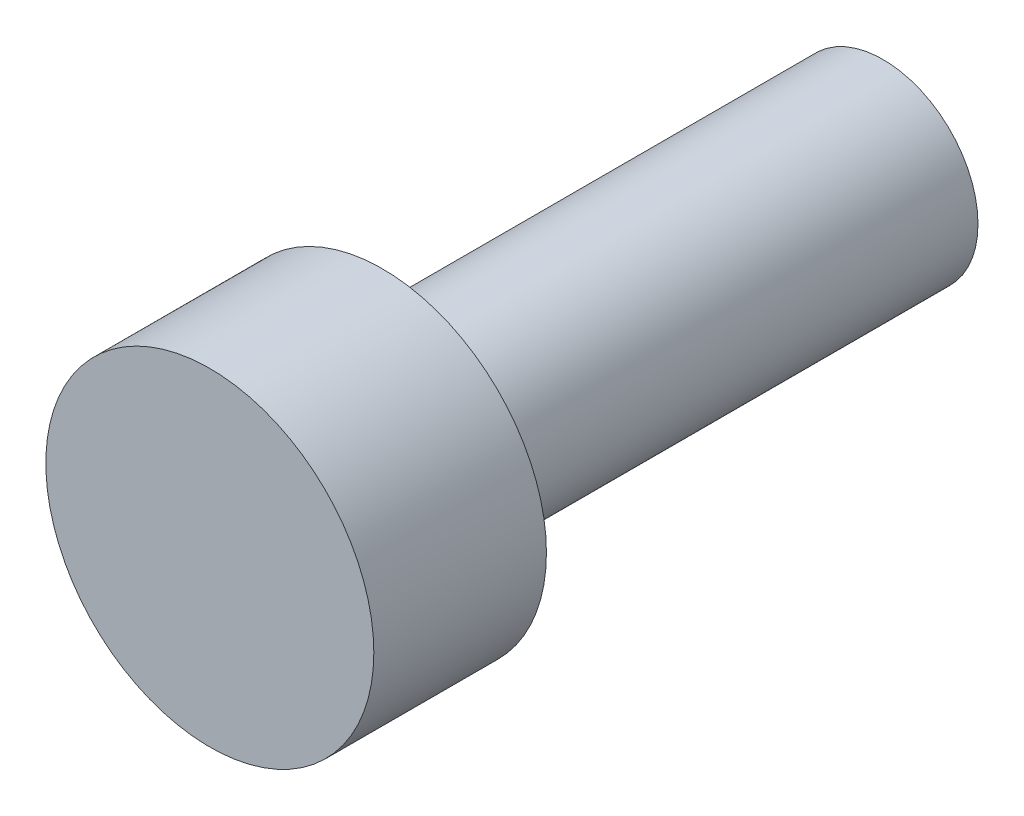
ISO-10303-21;
HEADER;
FILE_DESCRIPTION(('STEP AP214'),'2;1');
FILE_NAME('part.step','',(''),(''),'','','');
FILE_SCHEMA(('AUTOMOTIVE_DESIGN { 1 0 10303 214 1 1 1 1 }'));
ENDSEC;
DATA;
#1=APPLICATION_CONTEXT('core data for automotive mechanical design processes');
#2=APPLICATION_PROTOCOL_DEFINITION('international standard','automotive_design',2000,#1);
#3=PRODUCT_CONTEXT('',#1,'mechanical');
#4=PRODUCT('Part','Part','',(#3));
#5=PRODUCT_RELATED_PRODUCT_CATEGORY('part','',(#4));
#6=PRODUCT_DEFINITION_FORMATION('','',#4);
#7=PRODUCT_DEFINITION_CONTEXT('part definition',#1,'design');
#8=PRODUCT_DEFINITION('design','',#6,#7);
#9=PRODUCT_DEFINITION_SHAPE('','',#8);
#10=(LENGTH_UNIT() NAMED_UNIT(*) SI_UNIT(.MILLI.,.METRE.));
#11=(NAMED_UNIT(*) PLANE_ANGLE_UNIT() SI_UNIT($,.RADIAN.));
#12=(NAMED_UNIT(*) SI_UNIT($,.STERADIAN.) SOLID_ANGLE_UNIT());
#13=UNCERTAINTY_MEASURE_WITH_UNIT(LENGTH_MEASURE(1.E-05),#10,'distance_accuracy_value','');
#14=(GEOMETRIC_REPRESENTATION_CONTEXT(3) GLOBAL_UNCERTAINTY_ASSIGNED_CONTEXT((#13)) GLOBAL_UNIT_ASSIGNED_CONTEXT((#10,
#11,#12)) REPRESENTATION_CONTEXT('',''));
#15=CARTESIAN_POINT('',(0.,0.,0.));
#16=DIRECTION('',(0.,0.,1.));
#17=DIRECTION('',(1.,0.,0.));
#18=AXIS2_PLACEMENT_3D('',#15,#16,#17);
#19=CARTESIAN_POINT('',(0.,0.,15.875));
#20=DIRECTION('',(0.,0.,-1.));
#21=DIRECTION('',(-1.,0.,0.));
#22=AXIS2_PLACEMENT_3D('',#19,#20,#21);
#23=CYLINDRICAL_SURFACE('',#22,0.8509);
#24=CARTESIAN_POINT('',(0.,0.,15.875));
#25=DIRECTION('',(0.,0.,1.));
#26=DIRECTION('',(1.,0.,0.));
#27=AXIS2_PLACEMENT_3D('',#24,#25,#26);
#28=CIRCLE('',#27,0.8509);
#29=CARTESIAN_POINT('',(0.8509,0.,15.875));
#30=VERTEX_POINT('',#29);
#31=EDGE_CURVE('E151',#30,#30,#28,.T.);
#32=ORIENTED_EDGE('',*,*,#31,.T.);
#33=EDGE_LOOP('',(#32));
#34=FACE_BOUND('',#33,.T.);
#35=CARTESIAN_POINT('',(0.,0.,0.));
#36=DIRECTION('',(0.,0.,1.));
#37=DIRECTION('',(1.,0.,0.));
#38=AXIS2_PLACEMENT_3D('',#35,#36,#37);
#39=CIRCLE('',#38,0.8509);
#40=CARTESIAN_POINT('',(0.8509,0.,0.));
#41=VERTEX_POINT('',#40);
#42=EDGE_CURVE('E154',#41,#41,#39,.T.);
#43=ORIENTED_EDGE('',*,*,#42,.F.);
#44=EDGE_LOOP('',(#43));
#45=FACE_BOUND('',#44,.T.);
#46=CARTESIAN_POINT('',(0.00749999999999969,0.85086694612025,9.14757802701318));
#47=CARTESIAN_POINT('',(-0.00861376298900536,0.851021914727868,9.14702511198134));
#48=CARTESIAN_POINT('',(-0.0246674658571156,0.850693761714021,9.14815242592392));
#49=CARTESIAN_POINT('',(-0.0560168123220588,0.849192597367607,9.15306745672414));
#50=CARTESIAN_POINT('',(-0.0713211411848743,0.848036234841115,9.15680271164607));
#51=CARTESIAN_POINT('',(-0.109681641320358,0.844133564718623,9.1689531107026));
#52=CARTESIAN_POINT('',(-0.132196939446031,0.840857056453343,9.17882163606481));
#53=CARTESIAN_POINT('',(-0.175816323731571,0.832836804947554,9.20120580421419));
#54=CARTESIAN_POINT('',(-0.196900504324403,0.828076120029503,9.21375145569625));
#55=CARTESIAN_POINT('',(-0.240955653406109,0.816434558168829,9.24217251902039));
#56=CARTESIAN_POINT('',(-0.26372853073048,0.80934173903741,9.25826443756483));
#57=CARTESIAN_POINT('',(-0.308101785268149,0.793509884492477,9.29124883611004));
#58=CARTESIAN_POINT('',(-0.329700983130395,0.784769231295353,9.30814209053114));
#59=CARTESIAN_POINT('',(-0.393015459011803,0.756121621347623,9.35916371630613));
#60=CARTESIAN_POINT('',(-0.433328507453483,0.733766919366353,9.3936919343938));
#61=CARTESIAN_POINT('',(-0.517722923244346,0.677508200609394,9.46781362143843));
#62=CARTESIAN_POINT('',(-0.561116872960894,0.642231232691138,9.50715908293735));
#63=CARTESIAN_POINT('',(-0.641857269655716,0.561503190326063,9.5813926054114));
#64=CARTESIAN_POINT('',(-0.679221176390604,0.516082431578308,9.61629347131475));
#65=CARTESIAN_POINT('',(-0.73253858133733,0.434499002631339,9.66643902739223));
#66=CARTESIAN_POINT('',(-0.751182941317496,0.40155266283285,9.68406455840293));
#67=CARTESIAN_POINT('',(-0.784408183640103,0.331988843571266,9.71556529583891));
#68=CARTESIAN_POINT('',(-0.798991974024972,0.295374017042099,9.729443185982));
#69=CARTESIAN_POINT('',(-0.823295939339063,0.218732263645706,9.75260817481186));
#70=CARTESIAN_POINT('',(-0.832968741888851,0.178676304636989,9.76185054840531));
#71=CARTESIAN_POINT('',(-0.846401966865187,0.0967093807448449,9.7746934271509));
#72=CARTESIAN_POINT('',(-0.850168572106056,0.0548004030007233,9.77829983221906));
#73=CARTESIAN_POINT('',(-0.851351393103853,-0.0234158268408078,9.77943212340604));
#74=CARTESIAN_POINT('',(-0.849567124036278,-0.0597036965114417,9.77772355042897));
#75=CARTESIAN_POINT('',(-0.841480665432997,-0.131295292393447,9.76998779090628));
#76=CARTESIAN_POINT('',(-0.835178235108409,-0.166598966049334,9.76396037419412));
#77=CARTESIAN_POINT('',(-0.818709065837848,-0.234375853347022,9.74823590821912));
#78=CARTESIAN_POINT('',(-0.808648858517979,-0.266899213793273,9.73864005341283));
#79=CARTESIAN_POINT('',(-0.785199704729032,-0.329565369035575,9.71632681269788));
#80=CARTESIAN_POINT('',(-0.771809782463182,-0.359707462566193,9.70360851174798));
#81=CARTESIAN_POINT('',(-0.735508262246376,-0.430439645125297,9.66923890979648));
#82=CARTESIAN_POINT('',(-0.711037248036748,-0.469537688499772,9.6461569899005));
#83=CARTESIAN_POINT('',(-0.657627438525002,-0.541837745179123,9.59617122142475));
#84=CARTESIAN_POINT('',(-0.628675920351472,-0.575022370658216,9.56925650715095));
#85=CARTESIAN_POINT('',(-0.556529698408921,-0.646307083855893,9.50296878162774));
#86=CARTESIAN_POINT('',(-0.511914204713301,-0.682008915599764,9.46255121036861));
#87=CARTESIAN_POINT('',(-0.441331863787135,-0.728040639926192,9.40082214807332));
#88=CARTESIAN_POINT('',(-0.417197062891208,-0.74213005099482,9.38006405840834));
#89=CARTESIAN_POINT('',(-0.367625899643333,-0.767895166092379,9.33860939263972));
#90=CARTESIAN_POINT('',(-0.342190397923345,-0.77957244102067,9.31791278520829));
#91=CARTESIAN_POINT('',(-0.294625987831255,-0.798595928912956,9.28104149247454));
#92=CARTESIAN_POINT('',(-0.272755703932982,-0.806343733276383,9.2647384975301));
#93=CARTESIAN_POINT('',(-0.22763353646878,-0.820227461694336,9.23327970643969));
#94=CARTESIAN_POINT('',(-0.204380048513451,-0.826361467359838,9.21812529074886));
#95=CARTESIAN_POINT('',(-0.162615947517307,-0.835409749458211,9.19418489250964));
#96=CARTESIAN_POINT('',(-0.14455226718943,-0.83874570262034,9.18479186206329));
#97=CARTESIAN_POINT('',(-0.107284051431283,-0.844317500965336,9.16842909186158));
#98=CARTESIAN_POINT('',(-0.088089100638634,-0.846561418340604,9.16144168615702));
#99=CARTESIAN_POINT('',(-0.0560678015371126,-0.849139096387613,9.15324145579016));
#100=CARTESIAN_POINT('',(-0.0435869606998704,-0.849874539567216,9.15084362495461));
#101=CARTESIAN_POINT('',(-0.0182421639407816,-0.850801943653632,9.14779250546573));
#102=CARTESIAN_POINT('',(-0.00537537244150704,-0.850987021442406,9.14716131692268));
#103=CARTESIAN_POINT('',(0.00750000000000176,-0.85086694612025,9.14757802701319));
#104=B_SPLINE_CURVE_WITH_KNOTS('',3,(#46,#47,#48,#49,#50,#51,#52,#53,#54,#55,#56,#57,#58,#59,
#60,#61,#62,#63,#64,#65,#66,#67,#68,#69,#70,#71,#72,#73,#74,#75,#76,#77,#78,#79,#80,#81,#82,#83,
#84,#85,#86,#87,#88,#89,#90,#91,#92,#93,#94,#95,#96,#97,#98,#99,#100,#101,#102,#103),
.UNSPECIFIED.,.F.,.F.,(4,2,2,2,2,2,2,2,2,2,2,2,2,2,2,2,2,2,2,2,2,2,2,2,2,2,2,2,4),(0.,
0.0481031470387628,0.095265518329707,0.169247296520284,0.244106559461097,0.330307169466197,
0.416592853016834,0.588860848230012,0.793073139658297,0.996683101462913,1.12152283154024,
1.24627292430703,1.37220454738077,1.49800425259779,1.60656449625899,1.71513052591179,
1.82082727389562,1.92655503364645,2.08042449568311,2.23473918706514,2.4435128847338,
2.54787966786635,2.65217826652701,2.73718479936136,2.82229193098987,2.88407224682871,
2.94538867901291,2.98345100855002,3.02198740163858),.UNSPECIFIED.);
#105=CARTESIAN_POINT('',(0.00749999999999969,0.85086694612025,9.14757802701318));
#106=VERTEX_POINT('',#105);
#107=CARTESIAN_POINT('',(0.00749999999999969,-0.85086694612025,9.14757802701318));
#108=VERTEX_POINT('',#107);
#109=EDGE_CURVE('E89',#106,#108,#104,.T.);
#110=ORIENTED_EDGE('',*,*,#109,.F.);
#111=DIRECTION('',(0.,0.,-1.));
#112=VECTOR('',#111,1.);
#113=CARTESIAN_POINT('',(0.00749999999999969,0.85086694612025,15.875));
#114=LINE('',#113,#112);
#115=CARTESIAN_POINT('',(0.00749999999999969,0.85086694612025,8.63242197298682));
#116=VERTEX_POINT('',#115);
#117=EDGE_CURVE('E81',#106,#116,#114,.T.);
#118=ORIENTED_EDGE('',*,*,#117,.T.);
#119=CARTESIAN_POINT('',(0.00749999999999969,-0.85086694612025,8.63242197298682));
#120=CARTESIAN_POINT('',(-0.00861376298900536,-0.851021914727868,8.63297488801866));
#121=CARTESIAN_POINT('',(-0.0246674658571156,-0.850693761714021,8.63184757407608));
#122=CARTESIAN_POINT('',(-0.0560168123220588,-0.849192597367607,8.62693254327586));
#123=CARTESIAN_POINT('',(-0.0713211411848743,-0.848036234841115,8.62319728835393));
#124=CARTESIAN_POINT('',(-0.109681641320358,-0.844133564718623,8.61104688929739));
#125=CARTESIAN_POINT('',(-0.132196939446031,-0.840857056453343,8.60117836393518));
#126=CARTESIAN_POINT('',(-0.175816323731571,-0.832836804947554,8.57879419578581));
#127=CARTESIAN_POINT('',(-0.196900504324403,-0.828076120029503,8.56624854430375));
#128=CARTESIAN_POINT('',(-0.240955653406109,-0.816434558168829,8.5378274809796));
#129=CARTESIAN_POINT('',(-0.26372853073048,-0.80934173903741,8.52173556243517));
#130=CARTESIAN_POINT('',(-0.308101785268149,-0.793509884492477,8.48875116388996));
#131=CARTESIAN_POINT('',(-0.329700983130395,-0.784769231295353,8.47185790946885));
#132=CARTESIAN_POINT('',(-0.393015459011803,-0.756121621347623,8.42083628369386));
#133=CARTESIAN_POINT('',(-0.433328507453483,-0.733766919366353,8.3863080656062));
#134=CARTESIAN_POINT('',(-0.517722923244346,-0.677508200609394,8.31218637856156));
#135=CARTESIAN_POINT('',(-0.561116872960894,-0.642231232691138,8.27284091706265));
#136=CARTESIAN_POINT('',(-0.641857269655716,-0.561503190326063,8.19860739458859));
#137=CARTESIAN_POINT('',(-0.679221176390604,-0.516082431578308,8.16370652868525));
#138=CARTESIAN_POINT('',(-0.73253858133733,-0.434499002631339,8.11356097260776));
#139=CARTESIAN_POINT('',(-0.751182941317496,-0.40155266283285,8.09593544159707));
#140=CARTESIAN_POINT('',(-0.784408183640103,-0.331988843571266,8.06443470416109));
#141=CARTESIAN_POINT('',(-0.798991974024972,-0.295374017042099,8.050556814018));
#142=CARTESIAN_POINT('',(-0.823295939339063,-0.218732263645706,8.02739182518813));
#143=CARTESIAN_POINT('',(-0.832968741888851,-0.178676304636989,8.01814945159469));
#144=CARTESIAN_POINT('',(-0.846401966865187,-0.0967093807448451,8.0053065728491));
#145=CARTESIAN_POINT('',(-0.850168572106056,-0.0548004030007234,8.00170016778093));
#146=CARTESIAN_POINT('',(-0.851351393103853,0.0234158268408078,8.00056787659396));
#147=CARTESIAN_POINT('',(-0.849567124036278,0.0597036965114417,8.00227644957103));
#148=CARTESIAN_POINT('',(-0.841480665432997,0.131295292393447,8.01001220909372));
#149=CARTESIAN_POINT('',(-0.835178235108409,0.166598966049334,8.01603962580588));
#150=CARTESIAN_POINT('',(-0.818709065837848,0.234375853347022,8.03176409178087));
#151=CARTESIAN_POINT('',(-0.808648858517979,0.266899213793273,8.04135994658717));
#152=CARTESIAN_POINT('',(-0.785199704729032,0.329565369035575,8.06367318730212));
#153=CARTESIAN_POINT('',(-0.771809782463182,0.359707462566193,8.07639148825202));
#154=CARTESIAN_POINT('',(-0.735508262246376,0.430439645125297,8.11076109020352));
#155=CARTESIAN_POINT('',(-0.711037248036748,0.469537688499772,8.1338430100995));
#156=CARTESIAN_POINT('',(-0.657627438525002,0.541837745179123,8.18382877857524));
#157=CARTESIAN_POINT('',(-0.628675920351472,0.575022370658216,8.21074349284905));
#158=CARTESIAN_POINT('',(-0.556529698408921,0.646307083855893,8.27703121837226));
#159=CARTESIAN_POINT('',(-0.511914204713301,0.682008915599764,8.31744878963138));
#160=CARTESIAN_POINT('',(-0.441331863787134,0.728040639926193,8.37917785192668));
#161=CARTESIAN_POINT('',(-0.417197062891206,0.742130050994822,8.39993594159166));
#162=CARTESIAN_POINT('',(-0.367625899643331,0.76789516609238,8.44139060736028));
#163=CARTESIAN_POINT('',(-0.342190397923344,0.779572441020671,8.4620872147917));
#164=CARTESIAN_POINT('',(-0.294625987831255,0.798595928912956,8.49895850752546));
#165=CARTESIAN_POINT('',(-0.272755703932982,0.806343733276383,8.5152615024699));
#166=CARTESIAN_POINT('',(-0.22763353646878,0.820227461694336,8.54672029356031));
#167=CARTESIAN_POINT('',(-0.204380048513451,0.826361467359838,8.56187470925114));
#168=CARTESIAN_POINT('',(-0.162615947517307,0.835409749458211,8.58581510749035));
#169=CARTESIAN_POINT('',(-0.14455226718943,0.83874570262034,8.59520813793671));
#170=CARTESIAN_POINT('',(-0.107284051431283,0.844317500965336,8.61157090813842));
#171=CARTESIAN_POINT('',(-0.088089100638634,0.846561418340604,8.61855831384297));
#172=CARTESIAN_POINT('',(-0.0560678015371126,0.849139096387613,8.62675854420983));
#173=CARTESIAN_POINT('',(-0.0435869606998704,0.849874539567216,8.62915637504539));
#174=CARTESIAN_POINT('',(-0.0182421639407816,0.850801943653632,8.63220749453427));
#175=CARTESIAN_POINT('',(-0.00537537244150704,0.850987021442406,8.63283868307731));
#176=CARTESIAN_POINT('',(0.00750000000000176,0.85086694612025,8.63242197298681));
#177=B_SPLINE_CURVE_WITH_KNOTS('',3,(#119,#120,#121,#122,#123,#124,#125,#126,#127,#128,#129,
#130,#131,#132,#133,#134,#135,#136,#137,#138,#139,#140,#141,#142,#143,#144,#145,#146,#147,#148,
#149,#150,#151,#152,#153,#154,#155,#156,#157,#158,#159,#160,#161,#162,#163,#164,#165,#166,#167,
#168,#169,#170,#171,#172,#173,#174,#175,#176),.UNSPECIFIED.,.F.,.F.,(4,2,2,2,2,2,2,2,2,2,2,2,2,
2,2,2,2,2,2,2,2,2,2,2,2,2,2,2,4),(0.,0.0481031470387628,0.095265518329707,0.169247296520284,
0.244106559461097,0.330307169466197,0.416592853016834,0.588860848230012,0.793073139658297,
0.996683101462913,1.12152283154024,1.24627292430703,1.37220454738077,1.49800425259779,
1.60656449625899,1.71513052591179,1.82082727389562,1.92655503364645,2.08042449568311,
2.23473918706514,2.4435128847338,2.54787966786635,2.65217826652701,2.73718479936136,
2.82229193098987,2.88407224682871,2.94538867901291,2.98345100855002,3.02198740163858),.UNSPECIFIED.);
#178=CARTESIAN_POINT('',(0.00749999999999969,-0.85086694612025,8.63242197298682));
#179=VERTEX_POINT('',#178);
#180=EDGE_CURVE('E95',#179,#116,#177,.T.);
#181=ORIENTED_EDGE('',*,*,#180,.F.);
#182=DIRECTION('',(0.,0.,-1.));
#183=VECTOR('',#182,1.);
#184=CARTESIAN_POINT('',(0.00749999999999969,-0.85086694612025,15.875));
#185=LINE('',#184,#183);
#186=EDGE_CURVE('E98',#179,#108,#185,.F.);
#187=ORIENTED_EDGE('',*,*,#186,.T.);
#188=EDGE_LOOP('',(#110,#118,#181,#187));
#189=FACE_BOUND('',#188,.T.);
#190=CARTESIAN_POINT('',(0.00749999999999969,0.85086694612025,2.79757802701317));
#191=CARTESIAN_POINT('',(-0.00861376298900477,0.851021914727867,2.79702511198133));
#192=CARTESIAN_POINT('',(-0.0246674658571147,0.850693761714021,2.79815242592391));
#193=CARTESIAN_POINT('',(-0.0560168123220575,0.849192597367607,2.80306745672413));
#194=CARTESIAN_POINT('',(-0.0713211411848727,0.848036234841116,2.80680271164606));
#195=CARTESIAN_POINT('',(-0.109681641320356,0.844133564718623,2.81895311070259));
#196=CARTESIAN_POINT('',(-0.132196939446029,0.840857056453343,2.82882163606481));
#197=CARTESIAN_POINT('',(-0.175816323731567,0.832836804947555,2.85120580421418));
#198=CARTESIAN_POINT('',(-0.1969005043244,0.828076120029504,2.86375145569624));
#199=CARTESIAN_POINT('',(-0.240955653406105,0.81643455816883,2.89217251902039));
#200=CARTESIAN_POINT('',(-0.263728530730476,0.809341739037411,2.90826443756482));
#201=CARTESIAN_POINT('',(-0.308101785268145,0.793509884492479,2.94124883611003));
#202=CARTESIAN_POINT('',(-0.32970098313039,0.784769231295356,2.95814209053114));
#203=CARTESIAN_POINT('',(-0.393015459011797,0.756121621347626,3.00916371630613));
#204=CARTESIAN_POINT('',(-0.433328507453476,0.733766919366357,3.04369193439379));
#205=CARTESIAN_POINT('',(-0.517722923244339,0.677508200609399,3.11781362143843));
#206=CARTESIAN_POINT('',(-0.561116872960887,0.642231232691144,3.15715908293734));
#207=CARTESIAN_POINT('',(-0.64185726965571,0.56150319032607,3.2313926054114));
#208=CARTESIAN_POINT('',(-0.679221176390598,0.516082431578315,3.26629347131474));
#209=CARTESIAN_POINT('',(-0.732538581337326,0.434499002631347,3.31643902739223));
#210=CARTESIAN_POINT('',(-0.751182941317492,0.401552662832858,3.33406455840292));
#211=CARTESIAN_POINT('',(-0.7844081836401,0.331988843571274,3.3655652958389));
#212=CARTESIAN_POINT('',(-0.798991974024969,0.295374017042107,3.379443185982));
#213=CARTESIAN_POINT('',(-0.823295939339061,0.218732263645714,3.40260817481186));
#214=CARTESIAN_POINT('',(-0.832968741888849,0.178676304636997,3.41185054840531));
#215=CARTESIAN_POINT('',(-0.846401966865186,0.0967093807448521,3.42469342715089));
#216=CARTESIAN_POINT('',(-0.850168572106055,0.0548004030007302,3.42829983221906));
#217=CARTESIAN_POINT('',(-0.851351393103853,-0.0234158268408014,3.42943212340604));
#218=CARTESIAN_POINT('',(-0.849567124036278,-0.0597036965114356,3.42772355042897));
#219=CARTESIAN_POINT('',(-0.841480665432998,-0.131295292393441,3.41998779090628));
#220=CARTESIAN_POINT('',(-0.83517823510841,-0.166598966049328,3.41396037419412));
#221=CARTESIAN_POINT('',(-0.818709065837849,-0.234375853347016,3.39823590821912));
#222=CARTESIAN_POINT('',(-0.808648858517981,-0.266899213793267,3.38864005341283));
#223=CARTESIAN_POINT('',(-0.785199704729034,-0.329565369035569,3.36632681269788));
#224=CARTESIAN_POINT('',(-0.771809782463184,-0.359707462566187,3.35360851174798));
#225=CARTESIAN_POINT('',(-0.735508262246379,-0.430439645125292,3.31923890979648));
#226=CARTESIAN_POINT('',(-0.711037248036752,-0.469537688499766,3.2961569899005));
#227=CARTESIAN_POINT('',(-0.657627438525007,-0.541837745179118,3.24617122142476));
#228=CARTESIAN_POINT('',(-0.628675920351477,-0.575022370658211,3.21925650715095));
#229=CARTESIAN_POINT('',(-0.556529698408927,-0.646307083855888,3.15296878162774));
#230=CARTESIAN_POINT('',(-0.511914204713307,-0.682008915599759,3.11255121036862));
#231=CARTESIAN_POINT('',(-0.441331863787142,-0.728040639926188,3.05082214807332));
#232=CARTESIAN_POINT('',(-0.417197062891215,-0.742130050994817,3.03006405840834));
#233=CARTESIAN_POINT('',(-0.367625899643341,-0.767895166092375,2.98860939263972));
#234=CARTESIAN_POINT('',(-0.342190397923354,-0.779572441020666,2.9679127852083));
#235=CARTESIAN_POINT('',(-0.294625987831265,-0.798595928912953,2.93104149247454));
#236=CARTESIAN_POINT('',(-0.272755703932992,-0.806343733276379,2.9147384975301));
#237=CARTESIAN_POINT('',(-0.227633536468789,-0.820227461694334,2.88327970643969));
#238=CARTESIAN_POINT('',(-0.204380048513459,-0.826361467359836,2.86812529074886));
#239=CARTESIAN_POINT('',(-0.162615947517315,-0.835409749458209,2.84418489250964));
#240=CARTESIAN_POINT('',(-0.144552267189438,-0.838745702620338,2.83479186206328));
#241=CARTESIAN_POINT('',(-0.10728405143129,-0.844317500965335,2.81842909186158));
#242=CARTESIAN_POINT('',(-0.0880891006386404,-0.846561418340603,2.81144168615702));
#243=CARTESIAN_POINT('',(-0.0560678015371176,-0.849139096387612,2.80324145579016));
#244=CARTESIAN_POINT('',(-0.0435869606998745,-0.849874539567215,2.8008436249546));
#245=CARTESIAN_POINT('',(-0.0182421639407838,-0.850801943653632,2.79779250546572));
#246=CARTESIAN_POINT('',(-0.0053753724415082,-0.850987021442406,2.79716131692268));
#247=CARTESIAN_POINT('',(0.00750000000000167,-0.85086694612025,2.79757802701318));
#248=B_SPLINE_CURVE_WITH_KNOTS('',3,(#190,#191,#192,#193,#194,#195,#196,#197,#198,#199,#200,
#201,#202,#203,#204,#205,#206,#207,#208,#209,#210,#211,#212,#213,#214,#215,#216,#217,#218,#219,
#220,#221,#222,#223,#224,#225,#226,#227,#228,#229,#230,#231,#232,#233,#234,#235,#236,#237,#238,
#239,#240,#241,#242,#243,#244,#245,#246,#247),.UNSPECIFIED.,.F.,.F.,(4,2,2,2,2,2,2,2,2,2,2,2,2,
2,2,2,2,2,2,2,2,2,2,2,2,2,2,2,4),(0.,0.0481031470387617,0.0952655183297048,0.16924729652028,
0.244106559461093,0.330307169466192,0.416592853016828,0.588860848230003,0.793073139658288,
0.996683101462904,1.12152283154023,1.24627292430703,1.37220454738077,1.49800425259779,
1.60656449625899,1.71513052591179,1.82082727389562,1.92655503364644,2.0804244956831,
2.23473918706513,2.4435128847338,2.54787966786634,2.652178266527,2.73718479936135,
2.82229193098987,2.8840722468287,2.9453886790129,2.98345100855002,3.02198740163858),.UNSPECIFIED.);
#249=CARTESIAN_POINT('',(0.00749999999999969,0.85086694612025,2.79757802701317));
#250=VERTEX_POINT('',#249);
#251=CARTESIAN_POINT('',(0.00749999999999969,-0.85086694612025,2.79757802701317));
#252=VERTEX_POINT('',#251);
#253=EDGE_CURVE('E48',#250,#252,#248,.T.);
#254=ORIENTED_EDGE('',*,*,#253,.F.);
#255=DIRECTION('',(0.,0.,-1.));
#256=VECTOR('',#255,1.);
#257=CARTESIAN_POINT('',(0.00749999999999969,0.85086694612025,15.875));
#258=LINE('',#257,#256);
#259=CARTESIAN_POINT('',(0.00749999999999969,0.85086694612025,2.28242197298682));
#260=VERTEX_POINT('',#259);
#261=EDGE_CURVE('E11',#250,#260,#258,.T.);
#262=ORIENTED_EDGE('',*,*,#261,.T.);
#263=CARTESIAN_POINT('',(0.00749999999999969,-0.85086694612025,2.28242197298682));
#264=CARTESIAN_POINT('',(-0.00861376298900478,-0.851021914727867,2.28297488801867));
#265=CARTESIAN_POINT('',(-0.0246674658571147,-0.850693761714021,2.28184757407608));
#266=CARTESIAN_POINT('',(-0.0560168123220575,-0.849192597367607,2.27693254327587));
#267=CARTESIAN_POINT('',(-0.0713211411848728,-0.848036234841116,2.27319728835393));
#268=CARTESIAN_POINT('',(-0.109681641320356,-0.844133564718623,2.2610468892974));
#269=CARTESIAN_POINT('',(-0.132196939446029,-0.840857056453343,2.25117836393519));
#270=CARTESIAN_POINT('',(-0.175816323731567,-0.832836804947555,2.22879419578582));
#271=CARTESIAN_POINT('',(-0.1969005043244,-0.828076120029504,2.21624854430375));
#272=CARTESIAN_POINT('',(-0.240955653406105,-0.81643455816883,2.18782748097961));
#273=CARTESIAN_POINT('',(-0.263728530730476,-0.809341739037411,2.17173556243518));
#274=CARTESIAN_POINT('',(-0.308101785268145,-0.793509884492479,2.13875116388997));
#275=CARTESIAN_POINT('',(-0.32970098313039,-0.784769231295355,2.12185790946886));
#276=CARTESIAN_POINT('',(-0.393015459011797,-0.756121621347626,2.07083628369387));
#277=CARTESIAN_POINT('',(-0.433328507453476,-0.733766919366357,2.03630806560621));
#278=CARTESIAN_POINT('',(-0.517722923244339,-0.677508200609399,1.96218637856157));
#279=CARTESIAN_POINT('',(-0.561116872960887,-0.642231232691144,1.92284091706266));
#280=CARTESIAN_POINT('',(-0.64185726965571,-0.56150319032607,1.8486073945886));
#281=CARTESIAN_POINT('',(-0.679221176390598,-0.516082431578315,1.81370652868526));
#282=CARTESIAN_POINT('',(-0.732538581337326,-0.434499002631347,1.76356097260777));
#283=CARTESIAN_POINT('',(-0.751182941317492,-0.401552662832858,1.74593544159708));
#284=CARTESIAN_POINT('',(-0.7844081836401,-0.331988843571274,1.7144347041611));
#285=CARTESIAN_POINT('',(-0.798991974024969,-0.295374017042106,1.700556814018));
#286=CARTESIAN_POINT('',(-0.823295939339061,-0.218732263645714,1.67739182518814));
#287=CARTESIAN_POINT('',(-0.832968741888849,-0.178676304636997,1.66814945159469));
#288=CARTESIAN_POINT('',(-0.846401966865186,-0.0967093807448521,1.6553065728491));
#289=CARTESIAN_POINT('',(-0.850168572106055,-0.0548004030007302,1.65170016778094));
#290=CARTESIAN_POINT('',(-0.851351393103853,0.0234158268408015,1.65056787659396));
#291=CARTESIAN_POINT('',(-0.849567124036278,0.0597036965114356,1.65227644957103));
#292=CARTESIAN_POINT('',(-0.841480665432998,0.131295292393441,1.66001220909372));
#293=CARTESIAN_POINT('',(-0.83517823510841,0.166598966049328,1.66603962580588));
#294=CARTESIAN_POINT('',(-0.818709065837849,0.234375853347017,1.68176409178087));
#295=CARTESIAN_POINT('',(-0.80864885851798,0.266899213793268,1.69135994658717));
#296=CARTESIAN_POINT('',(-0.785199704729034,0.32956536903557,1.71367318730212));
#297=CARTESIAN_POINT('',(-0.771809782463184,0.359707462566187,1.72639148825202));
#298=CARTESIAN_POINT('',(-0.735508262246379,0.430439645125292,1.76076109020352));
#299=CARTESIAN_POINT('',(-0.711037248036752,0.469537688499766,1.7838430100995));
#300=CARTESIAN_POINT('',(-0.657627438525007,0.541837745179118,1.83382877857524));
#301=CARTESIAN_POINT('',(-0.628675920351477,0.575022370658211,1.86074349284905));
#302=CARTESIAN_POINT('',(-0.556529698408927,0.646307083855888,1.92703121837226));
#303=CARTESIAN_POINT('',(-0.511914204713307,0.682008915599759,1.96744878963138));
#304=CARTESIAN_POINT('',(-0.441331863787142,0.728040639926188,2.02917785192668));
#305=CARTESIAN_POINT('',(-0.417197062891215,0.742130050994817,2.04993594159165));
#306=CARTESIAN_POINT('',(-0.367625899643341,0.767895166092375,2.09139060736027));
#307=CARTESIAN_POINT('',(-0.342190397923354,0.779572441020666,2.1120872147917));
#308=CARTESIAN_POINT('',(-0.294625987831265,0.798595928912953,2.14895850752546));
#309=CARTESIAN_POINT('',(-0.272755703932992,0.806343733276379,2.1652615024699));
#310=CARTESIAN_POINT('',(-0.227633536468789,0.820227461694334,2.1967202935603));
#311=CARTESIAN_POINT('',(-0.204380048513459,0.826361467359836,2.21187470925114));
#312=CARTESIAN_POINT('',(-0.162615947517315,0.835409749458209,2.23581510749035));
#313=CARTESIAN_POINT('',(-0.144552267189438,0.838745702620338,2.24520813793671));
#314=CARTESIAN_POINT('',(-0.10728405143129,0.844317500965335,2.26157090813842));
#315=CARTESIAN_POINT('',(-0.0880891006386406,0.846561418340603,2.26855831384298));
#316=CARTESIAN_POINT('',(-0.0560678015371178,0.849139096387612,2.27675854420984));
#317=CARTESIAN_POINT('',(-0.0435869606998747,0.849874539567215,2.2791563750454));
#318=CARTESIAN_POINT('',(-0.0182421639407838,0.850801943653631,2.28220749453427));
#319=CARTESIAN_POINT('',(-0.00537537244150815,0.850987021442406,2.28283868307732));
#320=CARTESIAN_POINT('',(0.00750000000000158,0.85086694612025,2.28242197298682));
#321=B_SPLINE_CURVE_WITH_KNOTS('',3,(#263,#264,#265,#266,#267,#268,#269,#270,#271,#272,#273,
#274,#275,#276,#277,#278,#279,#280,#281,#282,#283,#284,#285,#286,#287,#288,#289,#290,#291,#292,
#293,#294,#295,#296,#297,#298,#299,#300,#301,#302,#303,#304,#305,#306,#307,#308,#309,#310,#311,
#312,#313,#314,#315,#316,#317,#318,#319,#320),.UNSPECIFIED.,.F.,.F.,(4,2,2,2,2,2,2,2,2,2,2,2,2,
2,2,2,2,2,2,2,2,2,2,2,2,2,2,2,4),(0.,0.0481031470387618,0.0952655183297049,0.16924729652028,
0.244106559461093,0.330307169466192,0.416592853016829,0.588860848230003,0.793073139658288,
0.996683101462904,1.12152283154023,1.24627292430703,1.37220454738077,1.49800425259778,
1.60656449625899,1.71513052591179,1.82082727389562,1.92655503364644,2.0804244956831,
2.23473918706513,2.44351288473379,2.54787966786634,2.652178266527,2.73718479936135,
2.82229193098987,2.8840722468287,2.9453886790129,2.98345100855002,3.02198740163858),.UNSPECIFIED.);
#322=CARTESIAN_POINT('',(0.00749999999999969,-0.85086694612025,2.28242197298682));
#323=VERTEX_POINT('',#322);
#324=EDGE_CURVE('E311',#323,#260,#321,.T.);
#325=ORIENTED_EDGE('',*,*,#324,.F.);
#326=DIRECTION('',(0.,0.,-1.));
#327=VECTOR('',#326,1.);
#328=CARTESIAN_POINT('',(0.00749999999999969,-0.85086694612025,15.875));
#329=LINE('',#328,#327);
#330=EDGE_CURVE('E88',#323,#252,#329,.F.);
#331=ORIENTED_EDGE('',*,*,#330,.T.);
#332=EDGE_LOOP('',(#254,#262,#325,#331));
#333=FACE_BOUND('',#332,.T.);
#334=ADVANCED_FACE('F39',(#34,#45,#189,#333),#23,.F.);
#335=CARTESIAN_POINT('',(0.,0.,0.));
#336=DIRECTION('',(0.,0.,1.));
#337=DIRECTION('',(1.,0.,0.));
#338=AXIS2_PLACEMENT_3D('',#335,#336,#337);
#339=PLANE('',#338);
#340=CARTESIAN_POINT('',(0.,0.,0.));
#341=DIRECTION('',(0.,0.,1.));
#342=DIRECTION('',(1.,0.,0.));
#343=AXIS2_PLACEMENT_3D('',#340,#341,#342);
#344=CIRCLE('',#343,3.4925);
#345=CARTESIAN_POINT('',(3.4925,0.,0.));
#346=VERTEX_POINT('',#345);
#347=EDGE_CURVE('E157',#346,#346,#344,.T.);
#348=ORIENTED_EDGE('',*,*,#347,.F.);
#349=EDGE_LOOP('',(#348));
#350=FACE_BOUND('',#349,.T.);
#351=ORIENTED_EDGE('',*,*,#42,.T.);
#352=EDGE_LOOP('',(#351));
#353=FACE_BOUND('',#352,.T.);
#354=ADVANCED_FACE('F163',(#350,#353),#339,.F.);
#355=CARTESIAN_POINT('',(0.,0.,15.875));
#356=DIRECTION('',(0.,0.,-1.));
#357=DIRECTION('',(-1.,0.,0.));
#358=AXIS2_PLACEMENT_3D('',#355,#356,#357);
#359=CYLINDRICAL_SURFACE('',#358,3.4925);
#360=CARTESIAN_POINT('',(-3.4925,0.,3.429));
#361=CARTESIAN_POINT('',(-3.49249919066693,-0.049088601495295,3.42899867625039));
#362=CARTESIAN_POINT('',(-3.49145477999147,-0.09819182198302,3.42492048908504));
#363=CARTESIAN_POINT('',(-3.48738967969155,-0.194989030789687,3.40874110600403));
#364=CARTESIAN_POINT('',(-3.48436791520692,-0.242682237900499,3.39663554648015));
#365=CARTESIAN_POINT('',(-3.47668243010493,-0.335247766556389,3.36481647885609));
#366=CARTESIAN_POINT('',(-3.47202072090799,-0.380123464721744,3.34511228777282));
#367=CARTESIAN_POINT('',(-3.46155079926709,-0.465932665188331,3.2986885387789));
#368=CARTESIAN_POINT('',(-3.45574253792518,-0.506865999245577,3.27196868164945));
#369=CARTESIAN_POINT('',(-3.44347088376187,-0.584500020619225,3.2116712552734));
#370=CARTESIAN_POINT('',(-3.43699708815094,-0.621104815185571,3.17797233429914));
#371=CARTESIAN_POINT('',(-3.42419248977,-0.688208965775557,3.10493307473234));
#372=CARTESIAN_POINT('',(-3.417861703806,-0.718707607501994,3.06559207705299));
#373=CARTESIAN_POINT('',(-3.40595463764868,-0.773189105450083,2.98163528304953));
#374=CARTESIAN_POINT('',(-3.40039154258485,-0.797063880493989,2.93694730995349));
#375=CARTESIAN_POINT('',(-3.390801777138,-0.836924582535908,2.84402751345332));
#376=CARTESIAN_POINT('',(-3.3867748512036,-0.852911821804967,2.7957962810861));
#377=CARTESIAN_POINT('',(-3.38082041597405,-0.876214924005274,2.69821555926123));
#378=CARTESIAN_POINT('',(-3.37885113577009,-0.883703593531499,2.64890994637093));
#379=CARTESIAN_POINT('',(-3.37710999048699,-0.890335378264706,2.54970593300239));
#380=CARTESIAN_POINT('',(-3.3773377539063,-0.889479904395729,2.49980763416748));
#381=CARTESIAN_POINT('',(-3.37992745702568,-0.879585377999787,2.40216554153882));
#382=CARTESIAN_POINT('',(-3.3822354734312,-0.870753084997766,2.35439914119938));
#383=CARTESIAN_POINT('',(-3.38863958348742,-0.845485816868362,2.26104942806384));
#384=CARTESIAN_POINT('',(-3.3927358086768,-0.829050282449578,2.21546627613889));
#385=CARTESIAN_POINT('',(-3.40230373185236,-0.788868949479637,2.12722671897848));
#386=CARTESIAN_POINT('',(-3.40778931115303,-0.765048796829834,2.08460574059202));
#387=CARTESIAN_POINT('',(-3.41951011998108,-0.71082635969629,2.0038921047599));
#388=CARTESIAN_POINT('',(-3.42574548500956,-0.680422884678834,1.96580026830084));
#389=CARTESIAN_POINT('',(-3.43848965252409,-0.61282953786223,1.89404227829708));
#390=CARTESIAN_POINT('',(-3.44500108527825,-0.575465411230572,1.86054052067428));
#391=CARTESIAN_POINT('',(-3.45739750992192,-0.495570831495156,1.80024654013391));
#392=CARTESIAN_POINT('',(-3.46328248126476,-0.45304020903858,1.77345453724389));
#393=CARTESIAN_POINT('',(-3.47379397088151,-0.36378003113113,1.72727704854646));
#394=CARTESIAN_POINT('',(-3.47841579621164,-0.317035652899217,1.70791907722623));
#395=CARTESIAN_POINT('',(-3.48584617386546,-0.220812108004841,1.67738219244891));
#396=CARTESIAN_POINT('',(-3.48865508614442,-0.17133348634782,1.66620165529721));
#397=CARTESIAN_POINT('',(-3.49208956967031,-0.0724508395922149,1.65258995896411));
#398=CARTESIAN_POINT('',(-3.49277096904453,-0.0230795116422847,1.64993502474268));
#399=CARTESIAN_POINT('',(-3.49203306051902,0.0754022476248702,1.65283501507136));
#400=CARTESIAN_POINT('',(-3.4906139491358,0.124512702917053,1.65838917160731));
#401=CARTESIAN_POINT('',(-3.48587032635859,0.220295420494981,1.67736545826296));
#402=CARTESIAN_POINT('',(-3.48257557354824,0.266993621288239,1.69066477908151));
#403=CARTESIAN_POINT('',(-3.47445261026473,0.357493248374422,1.72461297689073));
#404=CARTESIAN_POINT('',(-3.46962424171986,0.401294375499745,1.74526261151406));
#405=CARTESIAN_POINT('',(-3.45883668342987,0.485641285767165,1.79375396466586));
#406=CARTESIAN_POINT('',(-3.4528584646122,0.526113071720565,1.82172005931352));
#407=CARTESIAN_POINT('',(-3.4404631327799,0.601868469008778,1.88389220643228));
#408=CARTESIAN_POINT('',(-3.4340459412232,0.637151148320057,1.91809937740677));
#409=CARTESIAN_POINT('',(-3.42129375688743,0.702454554555264,1.99282316800364));
#410=CARTESIAN_POINT('',(-3.41496503927157,0.732318050237572,2.0334785057352));
#411=CARTESIAN_POINT('',(-3.40328833411813,0.784799591014925,2.11935480879608));
#412=CARTESIAN_POINT('',(-3.39794030350124,0.807417954404448,2.1645755734414));
#413=CARTESIAN_POINT('',(-3.38889024971724,0.844597791767876,2.25805993627769));
#414=CARTESIAN_POINT('',(-3.38517852349502,0.8592068889875,2.30630360522155));
#415=CARTESIAN_POINT('',(-3.37981372809671,0.880075964979322,2.40467179603131));
#416=CARTESIAN_POINT('',(-3.37816018885183,0.88633785019229,2.45479588573343));
#417=CARTESIAN_POINT('',(-3.37713574591437,0.89023240575284,2.55389955597881));
#418=CARTESIAN_POINT('',(-3.37769826814151,0.888116741310678,2.60286871386086));
#419=CARTESIAN_POINT('',(-3.38088812350957,0.875894311748061,2.69972734336899));
#420=CARTESIAN_POINT('',(-3.38351541216618,0.865787718787957,2.747616838233));
#421=CARTESIAN_POINT('',(-3.39050098100085,0.838010080944647,2.84067160884151));
#422=CARTESIAN_POINT('',(-3.39484807243211,0.820387874672601,2.88585236136936));
#423=CARTESIAN_POINT('',(-3.40478464716188,0.778117639943781,2.97264883964563));
#424=CARTESIAN_POINT('',(-3.41037430894961,0.753468601972814,3.01426405203043));
#425=CARTESIAN_POINT('',(-3.42235465968929,0.697062440860578,3.09396032984938));
#426=CARTESIAN_POINT('',(-3.42876289372554,0.665131458661861,3.13191572597093));
#427=CARTESIAN_POINT('',(-3.44155545616225,0.595404447246445,3.202011397161));
#428=CARTESIAN_POINT('',(-3.44793977848808,0.557607019163253,3.23415028130037));
#429=CARTESIAN_POINT('',(-3.46010975607362,0.476354848560137,3.29229630648494));
#430=CARTESIAN_POINT('',(-3.46588176056195,0.432806405733612,3.31817559265404));
#431=CARTESIAN_POINT('',(-3.47603139467953,0.341833353195652,3.36220475221156));
#432=CARTESIAN_POINT('',(-3.48040999541171,0.294411472087245,3.38036001168114));
#433=CARTESIAN_POINT('',(-3.48665361965653,0.205914797710637,3.40581738551244));
#434=CARTESIAN_POINT('',(-3.48883071132201,0.165251307819706,3.41449170813743));
#435=CARTESIAN_POINT('',(-3.49175418591288,0.0830619874028716,3.42608334208508));
#436=CARTESIAN_POINT('',(-3.49250068481564,0.0415362270566835,3.42900112008822));
#437=CARTESIAN_POINT('',(-3.4925,0.,3.429));
#438=B_SPLINE_CURVE_WITH_KNOTS('',3,(#360,#361,#362,#363,#364,#365,#366,#367,#368,#369,#370,
#371,#372,#373,#374,#375,#376,#377,#378,#379,#380,#381,#382,#383,#384,#385,#386,#387,#388,#389,
#390,#391,#392,#393,#394,#395,#396,#397,#398,#399,#400,#401,#402,#403,#404,#405,#406,#407,#408,
#409,#410,#411,#412,#413,#414,#415,#416,#417,#418,#419,#420,#421,#422,#423,#424,#425,#426,#427,
#428,#429,#430,#431,#432,#433,#434,#435,#436,#437),.UNSPECIFIED.,.T.,.F.,(4,2,2,2,2,2,2,2,2,2,2,
2,2,2,2,2,2,2,2,2,2,2,2,2,2,2,2,2,2,2,2,2,2,2,2,2,2,2,4),(0.,0.147113560653348,
0.294307156557102,0.441320842827208,0.588340800263203,0.738171788549275,0.888020293822982,
1.04018661423862,1.19232760978016,1.34131625732011,1.49027971257729,1.63548946833896,
1.78070990737115,1.92744282762763,2.07420230538698,2.22530632860678,2.37641530620991,
2.52807829151805,2.67971115475231,2.82733005871755,2.9749351528424,3.12026115613157,
3.26560214322017,3.41359556284446,3.56161553142007,3.71341229163753,3.86520238217702,
4.01607985711301,4.16692286685513,4.31326937707089,4.459612734414,4.60501926311324,
4.75044669226952,4.89979839420864,5.04918576424845,5.20140640672863,5.35352072877074,
5.47801068187008,5.60249054220997),.UNSPECIFIED.);
#439=CARTESIAN_POINT('',(-3.4925,0.,3.429));
#440=VERTEX_POINT('',#439);
#441=EDGE_CURVE('E134',#440,#440,#438,.T.);
#442=ORIENTED_EDGE('',*,*,#441,.T.);
#443=EDGE_LOOP('',(#442));
#444=FACE_BOUND('',#443,.T.);
#445=CARTESIAN_POINT('',(-3.4925,0.,9.779));
#446=CARTESIAN_POINT('',(-3.49249919066693,-0.0490886014952951,9.77899867625039));
#447=CARTESIAN_POINT('',(-3.49145477999147,-0.0981918219830203,9.77492048908504));
#448=CARTESIAN_POINT('',(-3.48738967969155,-0.194989030789687,9.75874110600403));
#449=CARTESIAN_POINT('',(-3.48436791520691,-0.2426822379005,9.74663554648015));
#450=CARTESIAN_POINT('',(-3.47668243010493,-0.33524776655639,9.7148164788561));
#451=CARTESIAN_POINT('',(-3.47202072090799,-0.380123464721744,9.69511228777282));
#452=CARTESIAN_POINT('',(-3.46155079926709,-0.465932665188332,9.6486885387789));
#453=CARTESIAN_POINT('',(-3.45574253792518,-0.506865999245578,9.62196868164945));
#454=CARTESIAN_POINT('',(-3.44347088376187,-0.584500020619227,9.56167125527341));
#455=CARTESIAN_POINT('',(-3.43699708815093,-0.621104815185573,9.52797233429914));
#456=CARTESIAN_POINT('',(-3.42419248976999,-0.688208965775559,9.45493307473234));
#457=CARTESIAN_POINT('',(-3.417861703806,-0.718707607501996,9.41559207705299));
#458=CARTESIAN_POINT('',(-3.40595463764868,-0.773189105450084,9.33163528304953));
#459=CARTESIAN_POINT('',(-3.40039154258484,-0.79706388049399,9.28694730995349));
#460=CARTESIAN_POINT('',(-3.390801777138,-0.83692458253591,9.19402751345332));
#461=CARTESIAN_POINT('',(-3.3867748512036,-0.852911821804969,9.1457962810861));
#462=CARTESIAN_POINT('',(-3.38082041597405,-0.876214924005276,9.04821555926123));
#463=CARTESIAN_POINT('',(-3.37885113577009,-0.8837035935315,8.99890994637093));
#464=CARTESIAN_POINT('',(-3.37710999048699,-0.890335378264707,8.89970593300239));
#465=CARTESIAN_POINT('',(-3.3773377539063,-0.88947990439573,8.84980763416748));
#466=CARTESIAN_POINT('',(-3.37992745702568,-0.879585377999788,8.75216554153882));
#467=CARTESIAN_POINT('',(-3.3822354734312,-0.870753084997768,8.70439914119938));
#468=CARTESIAN_POINT('',(-3.38863958348742,-0.845485816868364,8.61104942806384));
#469=CARTESIAN_POINT('',(-3.3927358086768,-0.829050282449579,8.56546627613889));
#470=CARTESIAN_POINT('',(-3.40230373185236,-0.788868949479639,8.47722671897848));
#471=CARTESIAN_POINT('',(-3.40778931115303,-0.765048796829836,8.43460574059202));
#472=CARTESIAN_POINT('',(-3.41951011998108,-0.710826359696291,8.35389210475989));
#473=CARTESIAN_POINT('',(-3.42574548500956,-0.680422884678835,8.31580026830084));
#474=CARTESIAN_POINT('',(-3.43848965252409,-0.61282953786223,8.24404227829708));
#475=CARTESIAN_POINT('',(-3.44500108527825,-0.575465411230572,8.21054052067428));
#476=CARTESIAN_POINT('',(-3.45739750992192,-0.495570831495156,8.15024654013391));
#477=CARTESIAN_POINT('',(-3.46328248126476,-0.45304020903858,8.12345453724389));
#478=CARTESIAN_POINT('',(-3.47379397088151,-0.36378003113113,8.07727704854646));
#479=CARTESIAN_POINT('',(-3.47841579621164,-0.317035652899217,8.05791907722622));
#480=CARTESIAN_POINT('',(-3.48584617386546,-0.220812108004841,8.02738219244891));
#481=CARTESIAN_POINT('',(-3.48865508614442,-0.171333486347819,8.0162016552972));
#482=CARTESIAN_POINT('',(-3.49208956967031,-0.0724508395922141,8.00258995896411));
#483=CARTESIAN_POINT('',(-3.49277096904453,-0.0230795116422839,7.99993502474267));
#484=CARTESIAN_POINT('',(-3.49203306051902,0.0754022476248708,8.00283501507135));
#485=CARTESIAN_POINT('',(-3.4906139491358,0.124512702917054,8.00838917160731));
#486=CARTESIAN_POINT('',(-3.48587032635859,0.220295420494982,8.02736545826295));
#487=CARTESIAN_POINT('',(-3.48257557354824,0.266993621288239,8.04066477908151));
#488=CARTESIAN_POINT('',(-3.47445261026473,0.357493248374423,8.07461297689072));
#489=CARTESIAN_POINT('',(-3.46962424171986,0.401294375499746,8.09526261151406));
#490=CARTESIAN_POINT('',(-3.45883668342987,0.485641285767167,8.14375396466586));
#491=CARTESIAN_POINT('',(-3.4528584646122,0.526113071720566,8.17172005931352));
#492=CARTESIAN_POINT('',(-3.4404631327799,0.60186846900878,8.23389220643228));
#493=CARTESIAN_POINT('',(-3.4340459412232,0.637151148320059,8.26809937740677));
#494=CARTESIAN_POINT('',(-3.42129375688743,0.702454554555266,8.34282316800364));
#495=CARTESIAN_POINT('',(-3.41496503927157,0.732318050237574,8.3834785057352));
#496=CARTESIAN_POINT('',(-3.40328833411813,0.784799591014927,8.46935480879608));
#497=CARTESIAN_POINT('',(-3.39794030350124,0.80741795440445,8.5145755734414));
#498=CARTESIAN_POINT('',(-3.38889024971724,0.844597791767878,8.60805993627769));
#499=CARTESIAN_POINT('',(-3.38517852349502,0.859206888987502,8.65630360522155));
#500=CARTESIAN_POINT('',(-3.37981372809671,0.880075964979324,8.75467179603131));
#501=CARTESIAN_POINT('',(-3.37816018885183,0.886337850192292,8.80479588573342));
#502=CARTESIAN_POINT('',(-3.37713574591437,0.890232405752842,8.90389955597881));
#503=CARTESIAN_POINT('',(-3.37769826814151,0.88811674131068,8.95286871386086));
#504=CARTESIAN_POINT('',(-3.38088812350957,0.875894311748063,9.04972734336899));
#505=CARTESIAN_POINT('',(-3.38351541216618,0.865787718787959,9.097616838233));
#506=CARTESIAN_POINT('',(-3.39050098100085,0.838010080944649,9.19067160884151));
#507=CARTESIAN_POINT('',(-3.39484807243211,0.820387874672603,9.23585236136936));
#508=CARTESIAN_POINT('',(-3.40478464716188,0.778117639943782,9.32264883964563));
#509=CARTESIAN_POINT('',(-3.41037430894961,0.753468601972816,9.36426405203043));
#510=CARTESIAN_POINT('',(-3.42235465968929,0.69706244086058,9.44396032984938));
#511=CARTESIAN_POINT('',(-3.42876289372554,0.665131458661862,9.48191572597093));
#512=CARTESIAN_POINT('',(-3.44155545616225,0.595404447246447,9.552011397161));
#513=CARTESIAN_POINT('',(-3.44793977848808,0.557607019163254,9.58415028130037));
#514=CARTESIAN_POINT('',(-3.46010975607362,0.476354848560137,9.64229630648494));
#515=CARTESIAN_POINT('',(-3.46588176056195,0.432806405733612,9.66817559265404));
#516=CARTESIAN_POINT('',(-3.47603139467953,0.341833353195652,9.71220475221156));
#517=CARTESIAN_POINT('',(-3.48040999541171,0.294411472087245,9.73036001168114));
#518=CARTESIAN_POINT('',(-3.48665361965653,0.205914797710637,9.75581738551244));
#519=CARTESIAN_POINT('',(-3.48883071132201,0.165251307819706,9.76449170813743));
#520=CARTESIAN_POINT('',(-3.49175418591288,0.0830619874028719,9.77608334208508));
#521=CARTESIAN_POINT('',(-3.49250068481564,0.0415362270566837,9.77900112008822));
#522=CARTESIAN_POINT('',(-3.4925,0.,9.779));
#523=B_SPLINE_CURVE_WITH_KNOTS('',3,(#445,#446,#447,#448,#449,#450,#451,#452,#453,#454,#455,
#456,#457,#458,#459,#460,#461,#462,#463,#464,#465,#466,#467,#468,#469,#470,#471,#472,#473,#474,
#475,#476,#477,#478,#479,#480,#481,#482,#483,#484,#485,#486,#487,#488,#489,#490,#491,#492,#493,
#494,#495,#496,#497,#498,#499,#500,#501,#502,#503,#504,#505,#506,#507,#508,#509,#510,#511,#512,
#513,#514,#515,#516,#517,#518,#519,#520,#521,#522),.UNSPECIFIED.,.T.,.F.,(4,2,2,2,2,2,2,2,2,2,2,
2,2,2,2,2,2,2,2,2,2,2,2,2,2,2,2,2,2,2,2,2,2,2,2,2,2,2,4),(0.,0.147113560653348,
0.294307156557102,0.441320842827209,0.588340800263205,0.738171788549276,0.888020293822984,
1.04018661423863,1.19232760978016,1.34131625732011,1.4902797125773,1.63548946833897,
1.78070990737115,1.92744282762764,2.07420230538698,2.22530632860678,2.37641530620991,
2.52807829151806,2.67971115475231,2.82733005871756,2.9749351528424,3.12026115613157,
3.26560214322017,3.41359556284447,3.56161553142008,3.71341229163754,3.86520238217703,
4.01607985711302,4.16692286685514,4.3132693770709,4.45961273441401,4.60501926311325,
4.75044669226953,4.89979839420865,5.04918576424846,5.20140640672864,5.35352072877075,
5.47801068187009,5.60249054220998),.UNSPECIFIED.);
#524=CARTESIAN_POINT('',(-3.4925,0.,9.779));
#525=VERTEX_POINT('',#524);
#526=EDGE_CURVE('E128',#525,#525,#523,.T.);
#527=ORIENTED_EDGE('',*,*,#526,.T.);
#528=EDGE_LOOP('',(#527));
#529=FACE_BOUND('',#528,.T.);
#530=ORIENTED_EDGE('',*,*,#347,.T.);
#531=EDGE_LOOP('',(#530));
#532=FACE_BOUND('',#531,.T.);
#533=CARTESIAN_POINT('',(0.,0.,18.415));
#534=DIRECTION('',(0.,0.,1.));
#535=DIRECTION('',(1.,0.,0.));
#536=AXIS2_PLACEMENT_3D('',#533,#534,#535);
#537=CIRCLE('',#536,3.4925);
#538=CARTESIAN_POINT('',(3.4925,0.,18.415));
#539=VERTEX_POINT('',#538);
#540=EDGE_CURVE('E146',#539,#539,#537,.T.);
#541=ORIENTED_EDGE('',*,*,#540,.F.);
#542=EDGE_LOOP('',(#541));
#543=FACE_BOUND('',#542,.T.);
#544=ADVANCED_FACE('F41',(#444,#529,#532,#543),#359,.T.);
#545=CARTESIAN_POINT('',(0.,0.,15.875));
#546=DIRECTION('',(0.,0.,1.));
#547=DIRECTION('',(1.,0.,0.));
#548=AXIS2_PLACEMENT_3D('',#545,#546,#547);
#549=PLANE('',#548);
#550=ORIENTED_EDGE('',*,*,#31,.F.);
#551=EDGE_LOOP('',(#550));
#552=FACE_BOUND('',#551,.T.);
#553=ADVANCED_FACE('F174',(#552),#549,.F.);
#554=CARTESIAN_POINT('',(0.,0.,24.765));
#555=DIRECTION('',(0.,0.,-1.));
#556=DIRECTION('',(-1.,0.,0.));
#557=AXIS2_PLACEMENT_3D('',#554,#555,#556);
#558=CYLINDRICAL_SURFACE('',#557,6.0325);
#559=CARTESIAN_POINT('',(0.,0.,24.765));
#560=DIRECTION('',(0.,0.,1.));
#561=DIRECTION('',(1.,0.,0.));
#562=AXIS2_PLACEMENT_3D('',#559,#560,#561);
#563=CIRCLE('',#562,6.0325);
#564=CARTESIAN_POINT('',(6.0325,0.,24.765));
#565=VERTEX_POINT('',#564);
#566=EDGE_CURVE('E143',#565,#565,#563,.T.);
#567=ORIENTED_EDGE('',*,*,#566,.F.);
#568=EDGE_LOOP('',(#567));
#569=FACE_BOUND('',#568,.T.);
#570=CARTESIAN_POINT('',(0.,0.,18.415));
#571=DIRECTION('',(0.,0.,1.));
#572=DIRECTION('',(1.,0.,0.));
#573=AXIS2_PLACEMENT_3D('',#570,#571,#572);
#574=CIRCLE('',#573,6.0325);
#575=CARTESIAN_POINT('',(6.0325,0.,18.415));
#576=VERTEX_POINT('',#575);
#577=EDGE_CURVE('E142',#576,#576,#574,.T.);
#578=ORIENTED_EDGE('',*,*,#577,.T.);
#579=EDGE_LOOP('',(#578));
#580=FACE_BOUND('',#579,.T.);
#581=ADVANCED_FACE('F176',(#569,#580),#558,.T.);
#582=CARTESIAN_POINT('',(0.,0.,24.765));
#583=DIRECTION('',(0.,0.,1.));
#584=DIRECTION('',(1.,0.,0.));
#585=AXIS2_PLACEMENT_3D('',#582,#583,#584);
#586=PLANE('',#585);
#587=ORIENTED_EDGE('',*,*,#566,.T.);
#588=EDGE_LOOP('',(#587));
#589=FACE_BOUND('',#588,.T.);
#590=ADVANCED_FACE('F181',(#589),#586,.T.);
#591=CARTESIAN_POINT('',(0.,0.,18.415));
#592=DIRECTION('',(0.,0.,1.));
#593=DIRECTION('',(1.,0.,0.));
#594=AXIS2_PLACEMENT_3D('',#591,#592,#593);
#595=PLANE('',#594);
#596=ORIENTED_EDGE('',*,*,#540,.T.);
#597=EDGE_LOOP('',(#596));
#598=FACE_BOUND('',#597,.T.);
#599=ORIENTED_EDGE('',*,*,#577,.F.);
#600=EDGE_LOOP('',(#599));
#601=FACE_BOUND('',#600,.T.);
#602=ADVANCED_FACE('F119',(#598,#601),#595,.F.);
#603=CARTESIAN_POINT('',(0.00749999999999969,0.,8.89));
#604=DIRECTION('',(-1.,0.,0.));
#605=DIRECTION('',(0.,0.,1.));
#606=AXIS2_PLACEMENT_3D('',#603,#604,#605);
#607=CYLINDRICAL_SURFACE('',#606,0.889000000000002);
#608=ORIENTED_EDGE('',*,*,#109,.T.);
#609=CARTESIAN_POINT('',(0.00749999999999969,0.,8.89));
#610=DIRECTION('',(-1.,0.,0.));
#611=DIRECTION('',(0.,0.,1.));
#612=AXIS2_PLACEMENT_3D('',#609,#610,#611);
#613=CIRCLE('',#612,0.889000000000002);
#614=EDGE_CURVE('E61',#179,#108,#613,.T.);
#615=ORIENTED_EDGE('',*,*,#614,.F.);
#616=ORIENTED_EDGE('',*,*,#180,.T.);
#617=EDGE_CURVE('E84',#106,#116,#613,.T.);
#618=ORIENTED_EDGE('',*,*,#617,.F.);
#619=EDGE_LOOP('',(#608,#615,#616,#618));
#620=FACE_BOUND('',#619,.T.);
#621=ORIENTED_EDGE('',*,*,#526,.F.);
#622=EDGE_LOOP('',(#621));
#623=FACE_BOUND('',#622,.T.);
#624=ADVANCED_FACE('F92',(#620,#623),#607,.F.);
#625=CARTESIAN_POINT('',(0.00749999999999969,0.,8.89));
#626=DIRECTION('',(-1.,0.,0.));
#627=DIRECTION('',(0.,0.,1.));
#628=AXIS2_PLACEMENT_3D('',#625,#626,#627);
#629=PLANE('',#628);
#630=ORIENTED_EDGE('',*,*,#617,.T.);
#631=ORIENTED_EDGE('',*,*,#117,.F.);
#632=EDGE_LOOP('',(#630,#631));
#633=FACE_BOUND('',#632,.T.);
#634=ADVANCED_FACE('F83',(#633),#629,.T.);
#635=ORIENTED_EDGE('',*,*,#614,.T.);
#636=ORIENTED_EDGE('',*,*,#186,.F.);
#637=EDGE_LOOP('',(#635,#636));
#638=FACE_BOUND('',#637,.T.);
#639=ADVANCED_FACE('F123',(#638),#629,.T.);
#640=CARTESIAN_POINT('',(0.00749999999999969,0.,2.54));
#641=DIRECTION('',(-1.,0.,0.));
#642=DIRECTION('',(0.,0.,1.));
#643=AXIS2_PLACEMENT_3D('',#640,#641,#642);
#644=CYLINDRICAL_SURFACE('',#643,0.889);
#645=ORIENTED_EDGE('',*,*,#253,.T.);
#646=CARTESIAN_POINT('',(0.00749999999999969,0.,2.54));
#647=DIRECTION('',(-1.,0.,0.));
#648=DIRECTION('',(0.,0.,1.));
#649=AXIS2_PLACEMENT_3D('',#646,#647,#648);
#650=CIRCLE('',#649,0.889);
#651=EDGE_CURVE('E54',#323,#252,#650,.T.);
#652=ORIENTED_EDGE('',*,*,#651,.F.);
#653=ORIENTED_EDGE('',*,*,#324,.T.);
#654=EDGE_CURVE('E135',#250,#260,#650,.T.);
#655=ORIENTED_EDGE('',*,*,#654,.F.);
#656=EDGE_LOOP('',(#645,#652,#653,#655));
#657=FACE_BOUND('',#656,.T.);
#658=ORIENTED_EDGE('',*,*,#441,.F.);
#659=EDGE_LOOP('',(#658));
#660=FACE_BOUND('',#659,.T.);
#661=ADVANCED_FACE('F120',(#657,#660),#644,.F.);
#662=CARTESIAN_POINT('',(0.00749999999999969,0.,2.54));
#663=DIRECTION('',(-1.,0.,0.));
#664=DIRECTION('',(0.,0.,1.));
#665=AXIS2_PLACEMENT_3D('',#662,#663,#664);
#666=PLANE('',#665);
#667=ORIENTED_EDGE('',*,*,#654,.T.);
#668=ORIENTED_EDGE('',*,*,#261,.F.);
#669=EDGE_LOOP('',(#667,#668));
#670=FACE_BOUND('',#669,.T.);
#671=ADVANCED_FACE('F223',(#670),#666,.T.);
#672=ORIENTED_EDGE('',*,*,#651,.T.);
#673=ORIENTED_EDGE('',*,*,#330,.F.);
#674=EDGE_LOOP('',(#672,#673));
#675=FACE_BOUND('',#674,.T.);
#676=ADVANCED_FACE('F230',(#675),#666,.T.);
#677=CLOSED_SHELL('',(#334,#354,#544,#553,#581,#590,#602,#624,#634,#639,#661,#671,#676));
#678=MANIFOLD_SOLID_BREP('B2',#677);
#679=ADVANCED_BREP_SHAPE_REPRESENTATION('',(#18,#678),#14);
#680=SHAPE_DEFINITION_REPRESENTATION(#9,#679);
ENDSEC;
END-ISO-10303-21;
